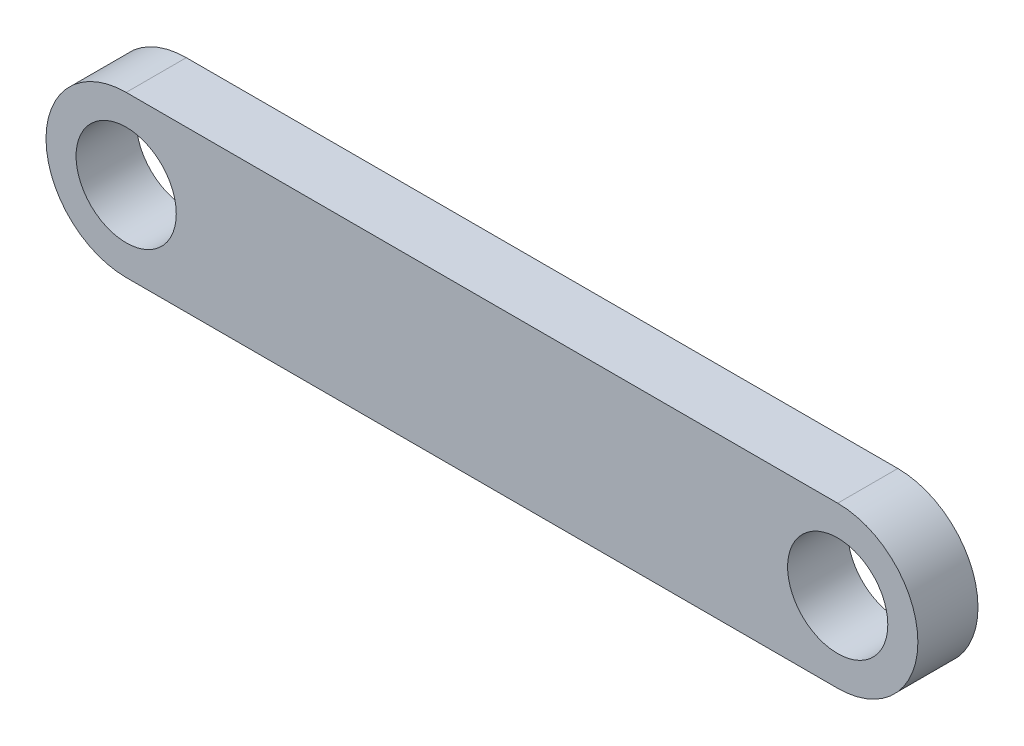
ISO-10303-21;
HEADER;
FILE_DESCRIPTION(('STEP AP214'),'2;1');
FILE_NAME('part.step','',(''),(''),'','','');
FILE_SCHEMA(('AUTOMOTIVE_DESIGN { 1 0 10303 214 1 1 1 1 }'));
ENDSEC;
DATA;
#1=APPLICATION_CONTEXT('core data for automotive mechanical design processes');
#2=APPLICATION_PROTOCOL_DEFINITION('international standard','automotive_design',2000,#1);
#3=PRODUCT_CONTEXT('',#1,'mechanical');
#4=PRODUCT('Part','Part','',(#3));
#5=PRODUCT_RELATED_PRODUCT_CATEGORY('part','',(#4));
#6=PRODUCT_DEFINITION_FORMATION('','',#4);
#7=PRODUCT_DEFINITION_CONTEXT('part definition',#1,'design');
#8=PRODUCT_DEFINITION('design','',#6,#7);
#9=PRODUCT_DEFINITION_SHAPE('','',#8);
#10=(LENGTH_UNIT() NAMED_UNIT(*) SI_UNIT(.MILLI.,.METRE.));
#11=(NAMED_UNIT(*) PLANE_ANGLE_UNIT() SI_UNIT($,.RADIAN.));
#12=(NAMED_UNIT(*) SI_UNIT($,.STERADIAN.) SOLID_ANGLE_UNIT());
#13=UNCERTAINTY_MEASURE_WITH_UNIT(LENGTH_MEASURE(1.E-05),#10,'distance_accuracy_value','');
#14=(GEOMETRIC_REPRESENTATION_CONTEXT(3) GLOBAL_UNCERTAINTY_ASSIGNED_CONTEXT((#13)) GLOBAL_UNIT_ASSIGNED_CONTEXT((#10,
#11,#12)) REPRESENTATION_CONTEXT('',''));
#15=CARTESIAN_POINT('',(0.,0.,0.));
#16=DIRECTION('',(0.,0.,1.));
#17=DIRECTION('',(1.,0.,0.));
#18=AXIS2_PLACEMENT_3D('',#15,#16,#17);
#19=CARTESIAN_POINT('',(0.,0.,3.));
#20=DIRECTION('',(0.,0.,1.));
#21=DIRECTION('',(1.,0.,0.));
#22=AXIS2_PLACEMENT_3D('',#19,#20,#21);
#23=PLANE('',#22);
#24=CARTESIAN_POINT('',(-35.5,0.,3.));
#25=DIRECTION('',(0.,0.,1.));
#26=DIRECTION('',(1.,0.,0.));
#27=AXIS2_PLACEMENT_3D('',#24,#25,#26);
#28=CIRCLE('',#27,2.5);
#29=CARTESIAN_POINT('',(-33.,0.,3.));
#30=VERTEX_POINT('',#29);
#31=EDGE_CURVE('E101',#30,#30,#28,.T.);
#32=ORIENTED_EDGE('',*,*,#31,.F.);
#33=EDGE_LOOP('',(#32));
#34=FACE_BOUND('',#33,.T.);
#35=CARTESIAN_POINT('',(0.,0.,3.));
#36=DIRECTION('',(0.,0.,1.));
#37=DIRECTION('',(1.,0.,0.));
#38=AXIS2_PLACEMENT_3D('',#35,#36,#37);
#39=CIRCLE('',#38,4.);
#40=CARTESIAN_POINT('',(0.,-4.,3.));
#41=VERTEX_POINT('',#40);
#42=CARTESIAN_POINT('',(0.,4.,3.));
#43=VERTEX_POINT('',#42);
#44=EDGE_CURVE('E86',#41,#43,#39,.T.);
#45=ORIENTED_EDGE('',*,*,#44,.T.);
#46=DIRECTION('',(-1.,0.,0.));
#47=VECTOR('',#46,1.);
#48=CARTESIAN_POINT('',(-35.5,3.99999999999999,3.));
#49=LINE('',#48,#47);
#50=CARTESIAN_POINT('',(-35.5,3.99999999999999,3.));
#51=VERTEX_POINT('',#50);
#52=EDGE_CURVE('E81',#43,#51,#49,.T.);
#53=ORIENTED_EDGE('',*,*,#52,.T.);
#54=CARTESIAN_POINT('',(-35.5,0.,3.));
#55=DIRECTION('',(0.,0.,1.));
#56=DIRECTION('',(1.,0.,0.));
#57=AXIS2_PLACEMENT_3D('',#54,#55,#56);
#58=CIRCLE('',#57,4.);
#59=CARTESIAN_POINT('',(-35.5,-4.,3.));
#60=VERTEX_POINT('',#59);
#61=EDGE_CURVE('E84',#51,#60,#58,.T.);
#62=ORIENTED_EDGE('',*,*,#61,.T.);
#63=DIRECTION('',(1.,0.,0.));
#64=VECTOR('',#63,1.);
#65=CARTESIAN_POINT('',(-35.5,-4.00000000000001,3.));
#66=LINE('',#65,#64);
#67=EDGE_CURVE('E51',#60,#41,#66,.T.);
#68=ORIENTED_EDGE('',*,*,#67,.T.);
#69=EDGE_LOOP('',(#45,#53,#62,#68));
#70=FACE_BOUND('',#69,.T.);
#71=CARTESIAN_POINT('',(0.,0.,3.));
#72=DIRECTION('',(0.,0.,1.));
#73=DIRECTION('',(1.,0.,0.));
#74=AXIS2_PLACEMENT_3D('',#71,#72,#73);
#75=CIRCLE('',#74,2.5);
#76=CARTESIAN_POINT('',(2.5,0.,3.));
#77=VERTEX_POINT('',#76);
#78=EDGE_CURVE('E116',#77,#77,#75,.T.);
#79=ORIENTED_EDGE('',*,*,#78,.F.);
#80=EDGE_LOOP('',(#79));
#81=FACE_BOUND('',#80,.T.);
#82=ADVANCED_FACE('F34',(#34,#70,#81),#23,.T.);
#83=CARTESIAN_POINT('',(0.,0.,0.));
#84=DIRECTION('',(0.,0.,1.));
#85=DIRECTION('',(1.,0.,0.));
#86=AXIS2_PLACEMENT_3D('',#83,#84,#85);
#87=PLANE('',#86);
#88=CARTESIAN_POINT('',(0.,0.,0.));
#89=DIRECTION('',(0.,0.,1.));
#90=DIRECTION('',(1.,0.,0.));
#91=AXIS2_PLACEMENT_3D('',#88,#89,#90);
#92=CIRCLE('',#91,4.);
#93=CARTESIAN_POINT('',(0.,-4.,0.));
#94=VERTEX_POINT('',#93);
#95=CARTESIAN_POINT('',(0.,4.,0.));
#96=VERTEX_POINT('',#95);
#97=EDGE_CURVE('E98',#94,#96,#92,.T.);
#98=ORIENTED_EDGE('',*,*,#97,.F.);
#99=DIRECTION('',(1.,0.,0.));
#100=VECTOR('',#99,1.);
#101=CARTESIAN_POINT('',(-35.5,-4.00000000000001,0.));
#102=LINE('',#101,#100);
#103=CARTESIAN_POINT('',(-35.5,-4.,0.));
#104=VERTEX_POINT('',#103);
#105=EDGE_CURVE('E74',#104,#94,#102,.T.);
#106=ORIENTED_EDGE('',*,*,#105,.F.);
#107=CARTESIAN_POINT('',(-35.5,0.,0.));
#108=DIRECTION('',(0.,0.,1.));
#109=DIRECTION('',(1.,0.,0.));
#110=AXIS2_PLACEMENT_3D('',#107,#108,#109);
#111=CIRCLE('',#110,4.);
#112=CARTESIAN_POINT('',(-35.5,3.99999999999999,0.));
#113=VERTEX_POINT('',#112);
#114=EDGE_CURVE('E68',#113,#104,#111,.T.);
#115=ORIENTED_EDGE('',*,*,#114,.F.);
#116=DIRECTION('',(-1.,0.,0.));
#117=VECTOR('',#116,1.);
#118=CARTESIAN_POINT('',(-35.5,3.99999999999999,0.));
#119=LINE('',#118,#117);
#120=EDGE_CURVE('E90',#96,#113,#119,.T.);
#121=ORIENTED_EDGE('',*,*,#120,.F.);
#122=EDGE_LOOP('',(#98,#106,#115,#121));
#123=FACE_BOUND('',#122,.T.);
#124=CARTESIAN_POINT('',(-35.5,0.,0.));
#125=DIRECTION('',(0.,0.,1.));
#126=DIRECTION('',(1.,0.,0.));
#127=AXIS2_PLACEMENT_3D('',#124,#125,#126);
#128=CIRCLE('',#127,2.5);
#129=CARTESIAN_POINT('',(-33.,0.,0.));
#130=VERTEX_POINT('',#129);
#131=EDGE_CURVE('E113',#130,#130,#128,.T.);
#132=ORIENTED_EDGE('',*,*,#131,.T.);
#133=EDGE_LOOP('',(#132));
#134=FACE_BOUND('',#133,.T.);
#135=CARTESIAN_POINT('',(0.,0.,0.));
#136=DIRECTION('',(0.,0.,1.));
#137=DIRECTION('',(1.,0.,0.));
#138=AXIS2_PLACEMENT_3D('',#135,#136,#137);
#139=CIRCLE('',#138,2.5);
#140=CARTESIAN_POINT('',(2.5,0.,0.));
#141=VERTEX_POINT('',#140);
#142=EDGE_CURVE('E119',#141,#141,#139,.T.);
#143=ORIENTED_EDGE('',*,*,#142,.T.);
#144=EDGE_LOOP('',(#143));
#145=FACE_BOUND('',#144,.T.);
#146=ADVANCED_FACE('F109',(#123,#134,#145),#87,.F.);
#147=CARTESIAN_POINT('',(0.,0.,3.));
#148=DIRECTION('',(0.,0.,-1.));
#149=DIRECTION('',(-1.,0.,0.));
#150=AXIS2_PLACEMENT_3D('',#147,#148,#149);
#151=CYLINDRICAL_SURFACE('',#150,4.);
#152=ORIENTED_EDGE('',*,*,#97,.T.);
#153=DIRECTION('',(0.,0.,-1.));
#154=VECTOR('',#153,1.);
#155=CARTESIAN_POINT('',(0.,4.,3.));
#156=LINE('',#155,#154);
#157=EDGE_CURVE('E11',#43,#96,#156,.T.);
#158=ORIENTED_EDGE('',*,*,#157,.F.);
#159=ORIENTED_EDGE('',*,*,#44,.F.);
#160=DIRECTION('',(0.,0.,-1.));
#161=VECTOR('',#160,1.);
#162=CARTESIAN_POINT('',(0.,-4.,3.));
#163=LINE('',#162,#161);
#164=EDGE_CURVE('E94',#41,#94,#163,.T.);
#165=ORIENTED_EDGE('',*,*,#164,.T.);
#166=EDGE_LOOP('',(#152,#158,#159,#165));
#167=FACE_BOUND('',#166,.T.);
#168=ADVANCED_FACE('F36',(#167),#151,.T.);
#169=CARTESIAN_POINT('',(-35.5,3.99999999999999,3.));
#170=DIRECTION('',(0.,-1.,0.));
#171=DIRECTION('',(1.,0.,0.));
#172=AXIS2_PLACEMENT_3D('',#169,#170,#171);
#173=PLANE('',#172);
#174=ORIENTED_EDGE('',*,*,#120,.T.);
#175=DIRECTION('',(0.,0.,-1.));
#176=VECTOR('',#175,1.);
#177=CARTESIAN_POINT('',(-35.5,3.99999999999999,3.));
#178=LINE('',#177,#176);
#179=EDGE_CURVE('E43',#51,#113,#178,.T.);
#180=ORIENTED_EDGE('',*,*,#179,.F.);
#181=ORIENTED_EDGE('',*,*,#52,.F.);
#182=ORIENTED_EDGE('',*,*,#157,.T.);
#183=EDGE_LOOP('',(#174,#180,#181,#182));
#184=FACE_BOUND('',#183,.T.);
#185=ADVANCED_FACE('F89',(#184),#173,.F.);
#186=CARTESIAN_POINT('',(-35.5,0.,3.));
#187=DIRECTION('',(0.,0.,-1.));
#188=DIRECTION('',(-1.,0.,0.));
#189=AXIS2_PLACEMENT_3D('',#186,#187,#188);
#190=CYLINDRICAL_SURFACE('',#189,4.);
#191=ORIENTED_EDGE('',*,*,#114,.T.);
#192=DIRECTION('',(0.,0.,-1.));
#193=VECTOR('',#192,1.);
#194=CARTESIAN_POINT('',(-35.5,-4.,3.));
#195=LINE('',#194,#193);
#196=EDGE_CURVE('E91',#60,#104,#195,.T.);
#197=ORIENTED_EDGE('',*,*,#196,.F.);
#198=ORIENTED_EDGE('',*,*,#61,.F.);
#199=ORIENTED_EDGE('',*,*,#179,.T.);
#200=EDGE_LOOP('',(#191,#197,#198,#199));
#201=FACE_BOUND('',#200,.T.);
#202=ADVANCED_FACE('F92',(#201),#190,.T.);
#203=CARTESIAN_POINT('',(-35.5,-4.00000000000001,3.));
#204=DIRECTION('',(0.,1.,0.));
#205=DIRECTION('',(-1.,0.,0.));
#206=AXIS2_PLACEMENT_3D('',#203,#204,#205);
#207=PLANE('',#206);
#208=ORIENTED_EDGE('',*,*,#105,.T.);
#209=ORIENTED_EDGE('',*,*,#164,.F.);
#210=ORIENTED_EDGE('',*,*,#67,.F.);
#211=ORIENTED_EDGE('',*,*,#196,.T.);
#212=EDGE_LOOP('',(#208,#209,#210,#211));
#213=FACE_BOUND('',#212,.T.);
#214=ADVANCED_FACE('F106',(#213),#207,.F.);
#215=CARTESIAN_POINT('',(-35.5,0.,3.));
#216=DIRECTION('',(0.,0.,-1.));
#217=DIRECTION('',(-1.,0.,0.));
#218=AXIS2_PLACEMENT_3D('',#215,#216,#217);
#219=CYLINDRICAL_SURFACE('',#218,2.5);
#220=ORIENTED_EDGE('',*,*,#31,.T.);
#221=EDGE_LOOP('',(#220));
#222=FACE_BOUND('',#221,.T.);
#223=ORIENTED_EDGE('',*,*,#131,.F.);
#224=EDGE_LOOP('',(#223));
#225=FACE_BOUND('',#224,.T.);
#226=ADVANCED_FACE('F136',(#222,#225),#219,.F.);
#227=CARTESIAN_POINT('',(0.,0.,3.));
#228=DIRECTION('',(0.,0.,-1.));
#229=DIRECTION('',(-1.,0.,0.));
#230=AXIS2_PLACEMENT_3D('',#227,#228,#229);
#231=CYLINDRICAL_SURFACE('',#230,2.5);
#232=ORIENTED_EDGE('',*,*,#78,.T.);
#233=EDGE_LOOP('',(#232));
#234=FACE_BOUND('',#233,.T.);
#235=ORIENTED_EDGE('',*,*,#142,.F.);
#236=EDGE_LOOP('',(#235));
#237=FACE_BOUND('',#236,.T.);
#238=ADVANCED_FACE('F125',(#234,#237),#231,.F.);
#239=CLOSED_SHELL('',(#82,#146,#168,#185,#202,#214,#226,#238));
#240=MANIFOLD_SOLID_BREP('B2',#239);
#241=ADVANCED_BREP_SHAPE_REPRESENTATION('',(#18,#240),#14);
#242=SHAPE_DEFINITION_REPRESENTATION(#9,#241);
ENDSEC;
END-ISO-10303-21;
